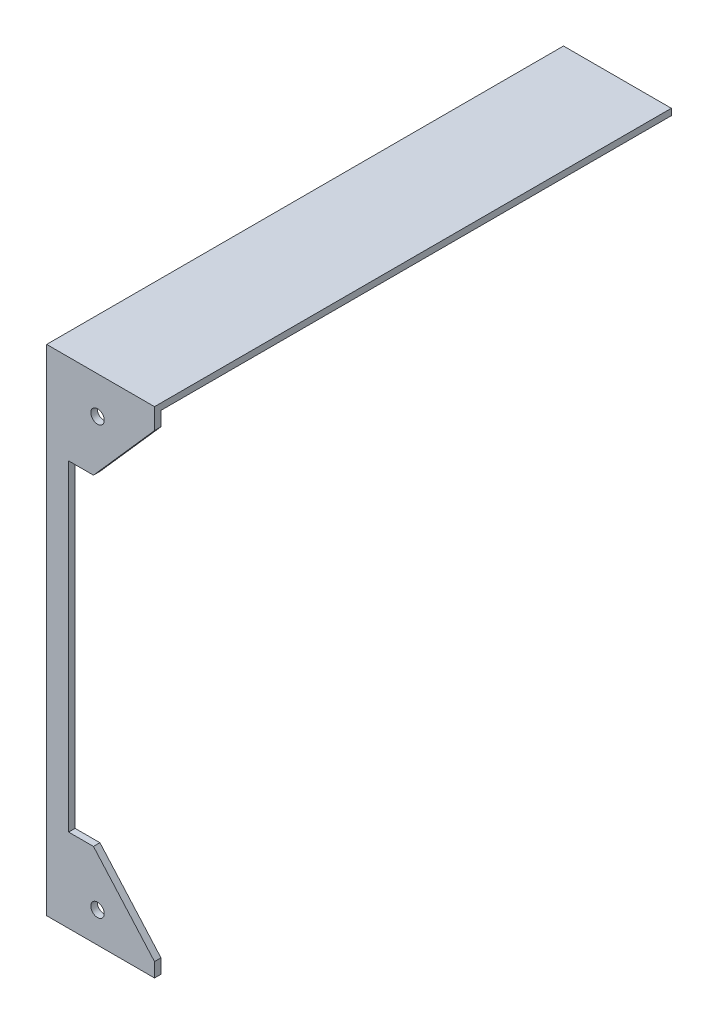
ISO-10303-21;
HEADER;
FILE_DESCRIPTION(('STEP AP214'),'2;1');
FILE_NAME('part.step','',(''),(''),'','','');
FILE_SCHEMA(('AUTOMOTIVE_DESIGN { 1 0 10303 214 1 1 1 1 }'));
ENDSEC;
DATA;
#1=APPLICATION_CONTEXT('core data for automotive mechanical design processes');
#2=APPLICATION_PROTOCOL_DEFINITION('international standard','automotive_design',2000,#1);
#3=PRODUCT_CONTEXT('',#1,'mechanical');
#4=PRODUCT('Part','Part','',(#3));
#5=PRODUCT_RELATED_PRODUCT_CATEGORY('part','',(#4));
#6=PRODUCT_DEFINITION_FORMATION('','',#4);
#7=PRODUCT_DEFINITION_CONTEXT('part definition',#1,'design');
#8=PRODUCT_DEFINITION('design','',#6,#7);
#9=PRODUCT_DEFINITION_SHAPE('','',#8);
#10=(LENGTH_UNIT() NAMED_UNIT(*) SI_UNIT(.MILLI.,.METRE.));
#11=(NAMED_UNIT(*) PLANE_ANGLE_UNIT() SI_UNIT($,.RADIAN.));
#12=(NAMED_UNIT(*) SI_UNIT($,.STERADIAN.) SOLID_ANGLE_UNIT());
#13=UNCERTAINTY_MEASURE_WITH_UNIT(LENGTH_MEASURE(1.E-05),#10,'distance_accuracy_value','');
#14=(GEOMETRIC_REPRESENTATION_CONTEXT(3) GLOBAL_UNCERTAINTY_ASSIGNED_CONTEXT((#13)) GLOBAL_UNIT_ASSIGNED_CONTEXT((#10,
#11,#12)) REPRESENTATION_CONTEXT('',''));
#15=CARTESIAN_POINT('',(0.,0.,0.));
#16=DIRECTION('',(0.,0.,1.));
#17=DIRECTION('',(1.,0.,0.));
#18=AXIS2_PLACEMENT_3D('',#15,#16,#17);
#19=CARTESIAN_POINT('',(0.,0.,1.5875));
#20=DIRECTION('',(0.,0.,-1.));
#21=DIRECTION('',(-1.,0.,0.));
#22=AXIS2_PLACEMENT_3D('',#19,#20,#21);
#23=PLANE('',#22);
#24=DIRECTION('',(0.,-1.,0.));
#25=VECTOR('',#24,1.);
#26=CARTESIAN_POINT('',(-250.,0.,1.5875));
#27=LINE('',#26,#25);
#28=CARTESIAN_POINT('',(-250.,121.5875,1.5875));
#29=VERTEX_POINT('',#28);
#30=CARTESIAN_POINT('',(-250.,0.,1.5875));
#31=VERTEX_POINT('',#30);
#32=EDGE_CURVE('E169',#29,#31,#27,.T.);
#33=ORIENTED_EDGE('',*,*,#32,.T.);
#34=DIRECTION('',(1.,0.,0.));
#35=VECTOR('',#34,1.);
#36=CARTESIAN_POINT('',(-223.5,0.,1.5875));
#37=LINE('',#36,#35);
#38=CARTESIAN_POINT('',(-223.5,0.,1.5875));
#39=VERTEX_POINT('',#38);
#40=EDGE_CURVE('E103',#31,#39,#37,.T.);
#41=ORIENTED_EDGE('',*,*,#40,.T.);
#42=DIRECTION('',(0.,1.,0.));
#43=VECTOR('',#42,1.);
#44=CARTESIAN_POINT('',(-223.5,3.5,1.5875));
#45=LINE('',#44,#43);
#46=CARTESIAN_POINT('',(-223.5,3.5,1.5875));
#47=VERTEX_POINT('',#46);
#48=EDGE_CURVE('E184',#39,#47,#45,.T.);
#49=ORIENTED_EDGE('',*,*,#48,.T.);
#50=DIRECTION('',(-0.661621637086846,0.749837855365093,0.));
#51=VECTOR('',#50,1.);
#52=CARTESIAN_POINT('',(-223.5,3.5,1.5875));
#53=LINE('',#52,#51);
#54=CARTESIAN_POINT('',(-238.5,20.5,1.5875));
#55=VERTEX_POINT('',#54);
#56=EDGE_CURVE('E197',#47,#55,#53,.T.);
#57=ORIENTED_EDGE('',*,*,#56,.T.);
#58=DIRECTION('',(-1.,0.,0.));
#59=VECTOR('',#58,1.);
#60=CARTESIAN_POINT('',(-238.5,20.5,1.5875));
#61=LINE('',#60,#59);
#62=CARTESIAN_POINT('',(-244.6,20.5,1.5875));
#63=VERTEX_POINT('',#62);
#64=EDGE_CURVE('E126',#55,#63,#61,.T.);
#65=ORIENTED_EDGE('',*,*,#64,.T.);
#66=DIRECTION('',(0.,1.,0.));
#67=VECTOR('',#66,1.);
#68=CARTESIAN_POINT('',(-244.6,20.5,1.5875));
#69=LINE('',#68,#67);
#70=CARTESIAN_POINT('',(-244.6,99.5,1.5875));
#71=VERTEX_POINT('',#70);
#72=EDGE_CURVE('E119',#63,#71,#69,.T.);
#73=ORIENTED_EDGE('',*,*,#72,.T.);
#74=DIRECTION('',(1.,0.,0.));
#75=VECTOR('',#74,1.);
#76=CARTESIAN_POINT('',(-244.6,99.5,1.5875));
#77=LINE('',#76,#75);
#78=CARTESIAN_POINT('',(-238.5,99.5,1.5875));
#79=VERTEX_POINT('',#78);
#80=EDGE_CURVE('E123',#71,#79,#77,.T.);
#81=ORIENTED_EDGE('',*,*,#80,.T.);
#82=DIRECTION('',(0.661621637086846,0.749837855365093,0.));
#83=VECTOR('',#82,1.);
#84=CARTESIAN_POINT('',(-238.5,99.5,1.5875));
#85=LINE('',#84,#83);
#86=CARTESIAN_POINT('',(-223.5,116.5,1.5875));
#87=VERTEX_POINT('',#86);
#88=EDGE_CURVE('E56',#79,#87,#85,.T.);
#89=ORIENTED_EDGE('',*,*,#88,.T.);
#90=DIRECTION('',(0.,1.,0.));
#91=VECTOR('',#90,1.);
#92=CARTESIAN_POINT('',(-223.5,116.5,1.5875));
#93=LINE('',#92,#91);
#94=CARTESIAN_POINT('',(-223.5,121.5875,1.5875));
#95=VERTEX_POINT('',#94);
#96=EDGE_CURVE('E143',#87,#95,#93,.T.);
#97=ORIENTED_EDGE('',*,*,#96,.T.);
#98=DIRECTION('',(1.,0.,0.));
#99=VECTOR('',#98,1.);
#100=CARTESIAN_POINT('',(-223.5,121.5875,1.5875));
#101=LINE('',#100,#99);
#102=EDGE_CURVE('E220',#29,#95,#101,.T.);
#103=ORIENTED_EDGE('',*,*,#102,.F.);
#104=EDGE_LOOP('',(#33,#41,#49,#57,#65,#73,#81,#89,#97,#103));
#105=FACE_BOUND('',#104,.T.);
#106=CARTESIAN_POINT('',(-237.5,112.5,1.5875));
#107=DIRECTION('',(0.,0.,1.));
#108=DIRECTION('',(1.,0.,0.));
#109=AXIS2_PLACEMENT_3D('',#106,#107,#108);
#110=CIRCLE('',#109,1.65);
#111=CARTESIAN_POINT('',(-235.85,112.5,1.5875));
#112=VERTEX_POINT('',#111);
#113=EDGE_CURVE('E153',#112,#112,#110,.T.);
#114=ORIENTED_EDGE('',*,*,#113,.F.);
#115=EDGE_LOOP('',(#114));
#116=FACE_BOUND('',#115,.T.);
#117=CARTESIAN_POINT('',(-237.5,7.5,1.5875));
#118=DIRECTION('',(0.,0.,1.));
#119=DIRECTION('',(1.,0.,0.));
#120=AXIS2_PLACEMENT_3D('',#117,#118,#119);
#121=CIRCLE('',#120,1.65);
#122=CARTESIAN_POINT('',(-235.85,7.5,1.5875));
#123=VERTEX_POINT('',#122);
#124=EDGE_CURVE('E206',#123,#123,#121,.T.);
#125=ORIENTED_EDGE('',*,*,#124,.F.);
#126=EDGE_LOOP('',(#125));
#127=FACE_BOUND('',#126,.T.);
#128=ADVANCED_FACE('F39',(#105,#116,#127),#23,.F.);
#129=CARTESIAN_POINT('',(0.,0.,0.));
#130=DIRECTION('',(0.,0.,-1.));
#131=DIRECTION('',(-1.,0.,0.));
#132=AXIS2_PLACEMENT_3D('',#129,#130,#131);
#133=PLANE('',#132);
#134=CARTESIAN_POINT('',(-237.5,112.5,0.));
#135=DIRECTION('',(0.,0.,1.));
#136=DIRECTION('',(1.,0.,0.));
#137=AXIS2_PLACEMENT_3D('',#134,#135,#136);
#138=CIRCLE('',#137,1.65);
#139=CARTESIAN_POINT('',(-235.85,112.5,0.));
#140=VERTEX_POINT('',#139);
#141=EDGE_CURVE('E203',#140,#140,#138,.T.);
#142=ORIENTED_EDGE('',*,*,#141,.T.);
#143=EDGE_LOOP('',(#142));
#144=FACE_BOUND('',#143,.T.);
#145=DIRECTION('',(0.,-1.,0.));
#146=VECTOR('',#145,1.);
#147=CARTESIAN_POINT('',(-250.,0.,0.));
#148=LINE('',#147,#146);
#149=CARTESIAN_POINT('',(-250.,120.,0.));
#150=VERTEX_POINT('',#149);
#151=CARTESIAN_POINT('',(-250.,0.,0.));
#152=VERTEX_POINT('',#151);
#153=EDGE_CURVE('E149',#150,#152,#148,.T.);
#154=ORIENTED_EDGE('',*,*,#153,.F.);
#155=DIRECTION('',(-1.,0.,0.));
#156=VECTOR('',#155,1.);
#157=CARTESIAN_POINT('',(-250.,120.,0.));
#158=LINE('',#157,#156);
#159=CARTESIAN_POINT('',(-223.5,120.,0.));
#160=VERTEX_POINT('',#159);
#161=EDGE_CURVE('E166',#160,#150,#158,.T.);
#162=ORIENTED_EDGE('',*,*,#161,.F.);
#163=DIRECTION('',(0.,1.,0.));
#164=VECTOR('',#163,1.);
#165=CARTESIAN_POINT('',(-223.5,116.5,0.));
#166=LINE('',#165,#164);
#167=CARTESIAN_POINT('',(-223.5,116.5,0.));
#168=VERTEX_POINT('',#167);
#169=EDGE_CURVE('E95',#168,#160,#166,.T.);
#170=ORIENTED_EDGE('',*,*,#169,.F.);
#171=DIRECTION('',(0.661621637086846,0.749837855365093,0.));
#172=VECTOR('',#171,1.);
#173=CARTESIAN_POINT('',(-238.5,99.5,0.));
#174=LINE('',#173,#172);
#175=CARTESIAN_POINT('',(-238.5,99.5,0.));
#176=VERTEX_POINT('',#175);
#177=EDGE_CURVE('E88',#176,#168,#174,.T.);
#178=ORIENTED_EDGE('',*,*,#177,.F.);
#179=DIRECTION('',(1.,0.,0.));
#180=VECTOR('',#179,1.);
#181=CARTESIAN_POINT('',(-244.6,99.5,0.));
#182=LINE('',#181,#180);
#183=CARTESIAN_POINT('',(-244.6,99.5,0.));
#184=VERTEX_POINT('',#183);
#185=EDGE_CURVE('E162',#184,#176,#182,.T.);
#186=ORIENTED_EDGE('',*,*,#185,.F.);
#187=DIRECTION('',(0.,1.,0.));
#188=VECTOR('',#187,1.);
#189=CARTESIAN_POINT('',(-244.6,20.5,0.));
#190=LINE('',#189,#188);
#191=CARTESIAN_POINT('',(-244.6,20.5,0.));
#192=VERTEX_POINT('',#191);
#193=EDGE_CURVE('E135',#192,#184,#190,.T.);
#194=ORIENTED_EDGE('',*,*,#193,.F.);
#195=DIRECTION('',(-1.,0.,0.));
#196=VECTOR('',#195,1.);
#197=CARTESIAN_POINT('',(-238.5,20.5,0.));
#198=LINE('',#197,#196);
#199=CARTESIAN_POINT('',(-238.5,20.5,0.));
#200=VERTEX_POINT('',#199);
#201=EDGE_CURVE('E159',#200,#192,#198,.T.);
#202=ORIENTED_EDGE('',*,*,#201,.F.);
#203=DIRECTION('',(-0.661621637086846,0.749837855365093,0.));
#204=VECTOR('',#203,1.);
#205=CARTESIAN_POINT('',(-223.5,3.5,0.));
#206=LINE('',#205,#204);
#207=CARTESIAN_POINT('',(-223.5,3.5,0.));
#208=VERTEX_POINT('',#207);
#209=EDGE_CURVE('E157',#208,#200,#206,.T.);
#210=ORIENTED_EDGE('',*,*,#209,.F.);
#211=DIRECTION('',(0.,1.,0.));
#212=VECTOR('',#211,1.);
#213=CARTESIAN_POINT('',(-223.5,3.5,0.));
#214=LINE('',#213,#212);
#215=CARTESIAN_POINT('',(-223.5,0.,0.));
#216=VERTEX_POINT('',#215);
#217=EDGE_CURVE('E155',#216,#208,#214,.T.);
#218=ORIENTED_EDGE('',*,*,#217,.F.);
#219=DIRECTION('',(1.,0.,0.));
#220=VECTOR('',#219,1.);
#221=CARTESIAN_POINT('',(-223.5,0.,0.));
#222=LINE('',#221,#220);
#223=EDGE_CURVE('E152',#152,#216,#222,.T.);
#224=ORIENTED_EDGE('',*,*,#223,.F.);
#225=EDGE_LOOP('',(#154,#162,#170,#178,#186,#194,#202,#210,#218,#224));
#226=FACE_BOUND('',#225,.T.);
#227=CARTESIAN_POINT('',(-237.5,7.5,0.));
#228=DIRECTION('',(0.,0.,1.));
#229=DIRECTION('',(1.,0.,0.));
#230=AXIS2_PLACEMENT_3D('',#227,#228,#229);
#231=CIRCLE('',#230,1.65);
#232=CARTESIAN_POINT('',(-235.85,7.5,0.));
#233=VERTEX_POINT('',#232);
#234=EDGE_CURVE('E209',#233,#233,#231,.T.);
#235=ORIENTED_EDGE('',*,*,#234,.T.);
#236=EDGE_LOOP('',(#235));
#237=FACE_BOUND('',#236,.T.);
#238=ADVANCED_FACE('F188',(#144,#226,#237),#133,.T.);
#239=CARTESIAN_POINT('',(-250.,0.,1.5875));
#240=DIRECTION('',(1.,0.,0.));
#241=DIRECTION('',(0.,0.,-1.));
#242=AXIS2_PLACEMENT_3D('',#239,#240,#241);
#243=PLANE('',#242);
#244=ORIENTED_EDGE('',*,*,#153,.T.);
#245=DIRECTION('',(0.,0.,-1.));
#246=VECTOR('',#245,1.);
#247=CARTESIAN_POINT('',(-250.,0.,1.5875));
#248=LINE('',#247,#246);
#249=EDGE_CURVE('E11',#31,#152,#248,.T.);
#250=ORIENTED_EDGE('',*,*,#249,.F.);
#251=ORIENTED_EDGE('',*,*,#32,.F.);
#252=DIRECTION('',(0.,0.,1.));
#253=VECTOR('',#252,1.);
#254=CARTESIAN_POINT('',(-250.,121.5875,1.5875));
#255=LINE('',#254,#253);
#256=CARTESIAN_POINT('',(-250.,121.5875,-125.4125));
#257=VERTEX_POINT('',#256);
#258=EDGE_CURVE('E232',#257,#29,#255,.T.);
#259=ORIENTED_EDGE('',*,*,#258,.F.);
#260=DIRECTION('',(0.,-1.,0.));
#261=VECTOR('',#260,1.);
#262=CARTESIAN_POINT('',(-250.,121.5875,-125.4125));
#263=LINE('',#262,#261);
#264=CARTESIAN_POINT('',(-250.,120.,-125.4125));
#265=VERTEX_POINT('',#264);
#266=EDGE_CURVE('E217',#257,#265,#263,.T.);
#267=ORIENTED_EDGE('',*,*,#266,.T.);
#268=DIRECTION('',(0.,0.,1.));
#269=VECTOR('',#268,1.);
#270=CARTESIAN_POINT('',(-250.,120.,1.5875));
#271=LINE('',#270,#269);
#272=EDGE_CURVE('E221',#265,#150,#271,.T.);
#273=ORIENTED_EDGE('',*,*,#272,.T.);
#274=EDGE_LOOP('',(#244,#250,#251,#259,#267,#273));
#275=FACE_BOUND('',#274,.T.);
#276=ADVANCED_FACE('F41',(#275),#243,.F.);
#277=CARTESIAN_POINT('',(-223.5,0.,1.5875));
#278=DIRECTION('',(0.,1.,0.));
#279=DIRECTION('',(0.,0.,1.));
#280=AXIS2_PLACEMENT_3D('',#277,#278,#279);
#281=PLANE('',#280);
#282=ORIENTED_EDGE('',*,*,#223,.T.);
#283=DIRECTION('',(0.,0.,-1.));
#284=VECTOR('',#283,1.);
#285=CARTESIAN_POINT('',(-223.5,0.,1.5875));
#286=LINE('',#285,#284);
#287=EDGE_CURVE('E48',#39,#216,#286,.T.);
#288=ORIENTED_EDGE('',*,*,#287,.F.);
#289=ORIENTED_EDGE('',*,*,#40,.F.);
#290=ORIENTED_EDGE('',*,*,#249,.T.);
#291=EDGE_LOOP('',(#282,#288,#289,#290));
#292=FACE_BOUND('',#291,.T.);
#293=ADVANCED_FACE('F303',(#292),#281,.F.);
#294=CARTESIAN_POINT('',(-223.5,3.5,1.5875));
#295=DIRECTION('',(-1.,0.,0.));
#296=DIRECTION('',(0.,0.,1.));
#297=AXIS2_PLACEMENT_3D('',#294,#295,#296);
#298=PLANE('',#297);
#299=ORIENTED_EDGE('',*,*,#217,.T.);
#300=DIRECTION('',(0.,0.,-1.));
#301=VECTOR('',#300,1.);
#302=CARTESIAN_POINT('',(-223.5,3.5,1.5875));
#303=LINE('',#302,#301);
#304=EDGE_CURVE('E176',#47,#208,#303,.T.);
#305=ORIENTED_EDGE('',*,*,#304,.F.);
#306=ORIENTED_EDGE('',*,*,#48,.F.);
#307=ORIENTED_EDGE('',*,*,#287,.T.);
#308=EDGE_LOOP('',(#299,#305,#306,#307));
#309=FACE_BOUND('',#308,.T.);
#310=ADVANCED_FACE('F182',(#309),#298,.F.);
#311=CARTESIAN_POINT('',(-223.5,3.5,1.5875));
#312=DIRECTION('',(-0.749837855365093,-0.661621637086846,0.));
#313=DIRECTION('',(0.661621637086846,-0.749837855365093,0.));
#314=AXIS2_PLACEMENT_3D('',#311,#312,#313);
#315=PLANE('',#314);
#316=ORIENTED_EDGE('',*,*,#209,.T.);
#317=DIRECTION('',(0.,0.,-1.));
#318=VECTOR('',#317,1.);
#319=CARTESIAN_POINT('',(-238.5,20.5,1.5875));
#320=LINE('',#319,#318);
#321=EDGE_CURVE('E173',#55,#200,#320,.T.);
#322=ORIENTED_EDGE('',*,*,#321,.F.);
#323=ORIENTED_EDGE('',*,*,#56,.F.);
#324=ORIENTED_EDGE('',*,*,#304,.T.);
#325=EDGE_LOOP('',(#316,#322,#323,#324));
#326=FACE_BOUND('',#325,.T.);
#327=ADVANCED_FACE('F193',(#326),#315,.F.);
#328=CARTESIAN_POINT('',(-238.5,20.5,1.5875));
#329=DIRECTION('',(0.,-1.,0.));
#330=DIRECTION('',(0.,0.,-1.));
#331=AXIS2_PLACEMENT_3D('',#328,#329,#330);
#332=PLANE('',#331);
#333=ORIENTED_EDGE('',*,*,#201,.T.);
#334=DIRECTION('',(0.,0.,-1.));
#335=VECTOR('',#334,1.);
#336=CARTESIAN_POINT('',(-244.6,20.5,1.5875));
#337=LINE('',#336,#335);
#338=EDGE_CURVE('E138',#63,#192,#337,.T.);
#339=ORIENTED_EDGE('',*,*,#338,.F.);
#340=ORIENTED_EDGE('',*,*,#64,.F.);
#341=ORIENTED_EDGE('',*,*,#321,.T.);
#342=EDGE_LOOP('',(#333,#339,#340,#341));
#343=FACE_BOUND('',#342,.T.);
#344=ADVANCED_FACE('F196',(#343),#332,.F.);
#345=CARTESIAN_POINT('',(-244.6,20.5,1.5875));
#346=DIRECTION('',(-1.,0.,0.));
#347=DIRECTION('',(0.,0.,1.));
#348=AXIS2_PLACEMENT_3D('',#345,#346,#347);
#349=PLANE('',#348);
#350=ORIENTED_EDGE('',*,*,#193,.T.);
#351=DIRECTION('',(0.,0.,-1.));
#352=VECTOR('',#351,1.);
#353=CARTESIAN_POINT('',(-244.6,99.5,1.5875));
#354=LINE('',#353,#352);
#355=EDGE_CURVE('E132',#71,#184,#354,.T.);
#356=ORIENTED_EDGE('',*,*,#355,.F.);
#357=ORIENTED_EDGE('',*,*,#72,.F.);
#358=ORIENTED_EDGE('',*,*,#338,.T.);
#359=EDGE_LOOP('',(#350,#356,#357,#358));
#360=FACE_BOUND('',#359,.T.);
#361=ADVANCED_FACE('F133',(#360),#349,.F.);
#362=CARTESIAN_POINT('',(-244.6,99.5,1.5875));
#363=DIRECTION('',(0.,1.,0.));
#364=DIRECTION('',(0.,0.,1.));
#365=AXIS2_PLACEMENT_3D('',#362,#363,#364);
#366=PLANE('',#365);
#367=ORIENTED_EDGE('',*,*,#185,.T.);
#368=DIRECTION('',(0.,0.,-1.));
#369=VECTOR('',#368,1.);
#370=CARTESIAN_POINT('',(-238.5,99.5,1.5875));
#371=LINE('',#370,#369);
#372=EDGE_CURVE('E139',#79,#176,#371,.T.);
#373=ORIENTED_EDGE('',*,*,#372,.F.);
#374=ORIENTED_EDGE('',*,*,#80,.F.);
#375=ORIENTED_EDGE('',*,*,#355,.T.);
#376=EDGE_LOOP('',(#367,#373,#374,#375));
#377=FACE_BOUND('',#376,.T.);
#378=ADVANCED_FACE('F141',(#377),#366,.F.);
#379=CARTESIAN_POINT('',(-238.5,99.5,1.5875));
#380=DIRECTION('',(-0.749837855365093,0.661621637086846,0.));
#381=DIRECTION('',(-0.661621637086846,-0.749837855365093,0.));
#382=AXIS2_PLACEMENT_3D('',#379,#380,#381);
#383=PLANE('',#382);
#384=ORIENTED_EDGE('',*,*,#177,.T.);
#385=DIRECTION('',(0.,0.,-1.));
#386=VECTOR('',#385,1.);
#387=CARTESIAN_POINT('',(-223.5,116.5,1.5875));
#388=LINE('',#387,#386);
#389=EDGE_CURVE('E148',#87,#168,#388,.T.);
#390=ORIENTED_EDGE('',*,*,#389,.F.);
#391=ORIENTED_EDGE('',*,*,#88,.F.);
#392=ORIENTED_EDGE('',*,*,#372,.T.);
#393=EDGE_LOOP('',(#384,#390,#391,#392));
#394=FACE_BOUND('',#393,.T.);
#395=ADVANCED_FACE('F291',(#394),#383,.F.);
#396=CARTESIAN_POINT('',(-223.5,116.5,1.5875));
#397=DIRECTION('',(-1.,0.,0.));
#398=DIRECTION('',(0.,0.,1.));
#399=AXIS2_PLACEMENT_3D('',#396,#397,#398);
#400=PLANE('',#399);
#401=ORIENTED_EDGE('',*,*,#169,.T.);
#402=DIRECTION('',(0.,0.,-1.));
#403=VECTOR('',#402,1.);
#404=CARTESIAN_POINT('',(-223.5,120.,-125.4125));
#405=LINE('',#404,#403);
#406=CARTESIAN_POINT('',(-223.5,120.,-125.4125));
#407=VERTEX_POINT('',#406);
#408=EDGE_CURVE('E228',#160,#407,#405,.T.);
#409=ORIENTED_EDGE('',*,*,#408,.T.);
#410=DIRECTION('',(0.,-1.,0.));
#411=VECTOR('',#410,1.);
#412=CARTESIAN_POINT('',(-223.5,121.5875,-125.4125));
#413=LINE('',#412,#411);
#414=CARTESIAN_POINT('',(-223.5,121.5875,-125.4125));
#415=VERTEX_POINT('',#414);
#416=EDGE_CURVE('E212',#415,#407,#413,.T.);
#417=ORIENTED_EDGE('',*,*,#416,.F.);
#418=DIRECTION('',(0.,0.,-1.));
#419=VECTOR('',#418,1.);
#420=CARTESIAN_POINT('',(-223.5,121.5875,-125.4125));
#421=LINE('',#420,#419);
#422=EDGE_CURVE('E224',#95,#415,#421,.T.);
#423=ORIENTED_EDGE('',*,*,#422,.F.);
#424=ORIENTED_EDGE('',*,*,#96,.F.);
#425=ORIENTED_EDGE('',*,*,#389,.T.);
#426=EDGE_LOOP('',(#401,#409,#417,#423,#424,#425));
#427=FACE_BOUND('',#426,.T.);
#428=ADVANCED_FACE('F252',(#427),#400,.F.);
#429=CARTESIAN_POINT('',(-237.5,112.5,1.5875));
#430=DIRECTION('',(0.,0.,-1.));
#431=DIRECTION('',(-1.,0.,0.));
#432=AXIS2_PLACEMENT_3D('',#429,#430,#431);
#433=CYLINDRICAL_SURFACE('',#432,1.65);
#434=ORIENTED_EDGE('',*,*,#141,.F.);
#435=EDGE_LOOP('',(#434));
#436=FACE_BOUND('',#435,.T.);
#437=ORIENTED_EDGE('',*,*,#113,.T.);
#438=EDGE_LOOP('',(#437));
#439=FACE_BOUND('',#438,.T.);
#440=ADVANCED_FACE('F286',(#436,#439),#433,.F.);
#441=CARTESIAN_POINT('',(-237.5,7.5,1.5875));
#442=DIRECTION('',(0.,0.,-1.));
#443=DIRECTION('',(-1.,0.,0.));
#444=AXIS2_PLACEMENT_3D('',#441,#442,#443);
#445=CYLINDRICAL_SURFACE('',#444,1.65);
#446=ORIENTED_EDGE('',*,*,#234,.F.);
#447=EDGE_LOOP('',(#446));
#448=FACE_BOUND('',#447,.T.);
#449=ORIENTED_EDGE('',*,*,#124,.T.);
#450=EDGE_LOOP('',(#449));
#451=FACE_BOUND('',#450,.T.);
#452=ADVANCED_FACE('F323',(#448,#451),#445,.F.);
#453=CARTESIAN_POINT('',(-250.,121.5875,-125.4125));
#454=DIRECTION('',(0.,0.,1.));
#455=DIRECTION('',(1.,0.,0.));
#456=AXIS2_PLACEMENT_3D('',#453,#454,#455);
#457=PLANE('',#456);
#458=DIRECTION('',(-1.,0.,0.));
#459=VECTOR('',#458,1.);
#460=CARTESIAN_POINT('',(-250.,120.,-125.4125));
#461=LINE('',#460,#459);
#462=EDGE_CURVE('E225',#407,#265,#461,.T.);
#463=ORIENTED_EDGE('',*,*,#462,.T.);
#464=ORIENTED_EDGE('',*,*,#266,.F.);
#465=DIRECTION('',(-1.,0.,0.));
#466=VECTOR('',#465,1.);
#467=CARTESIAN_POINT('',(-250.,121.5875,-125.4125));
#468=LINE('',#467,#466);
#469=EDGE_CURVE('E235',#415,#257,#468,.T.);
#470=ORIENTED_EDGE('',*,*,#469,.F.);
#471=ORIENTED_EDGE('',*,*,#416,.T.);
#472=EDGE_LOOP('',(#463,#464,#470,#471));
#473=FACE_BOUND('',#472,.T.);
#474=ADVANCED_FACE('F257',(#473),#457,.F.);
#475=CARTESIAN_POINT('',(0.,121.5875,0.));
#476=DIRECTION('',(0.,-1.,0.));
#477=DIRECTION('',(0.,0.,-1.));
#478=AXIS2_PLACEMENT_3D('',#475,#476,#477);
#479=PLANE('',#478);
#480=ORIENTED_EDGE('',*,*,#422,.T.);
#481=ORIENTED_EDGE('',*,*,#469,.T.);
#482=ORIENTED_EDGE('',*,*,#258,.T.);
#483=ORIENTED_EDGE('',*,*,#102,.T.);
#484=EDGE_LOOP('',(#480,#481,#482,#483));
#485=FACE_BOUND('',#484,.T.);
#486=ADVANCED_FACE('F243',(#485),#479,.F.);
#487=CARTESIAN_POINT('',(0.,120.,0.));
#488=DIRECTION('',(0.,-1.,0.));
#489=DIRECTION('',(0.,0.,-1.));
#490=AXIS2_PLACEMENT_3D('',#487,#488,#489);
#491=PLANE('',#490);
#492=ORIENTED_EDGE('',*,*,#408,.F.);
#493=ORIENTED_EDGE('',*,*,#161,.T.);
#494=ORIENTED_EDGE('',*,*,#272,.F.);
#495=ORIENTED_EDGE('',*,*,#462,.F.);
#496=EDGE_LOOP('',(#492,#493,#494,#495));
#497=FACE_BOUND('',#496,.T.);
#498=ADVANCED_FACE('F269',(#497),#491,.T.);
#499=CLOSED_SHELL('',(#128,#238,#276,#293,#310,#327,#344,#361,#378,#395,#428,#440,#452,#474,
#486,#498));
#500=MANIFOLD_SOLID_BREP('B2',#499);
#501=ADVANCED_BREP_SHAPE_REPRESENTATION('',(#18,#500),#14);
#502=SHAPE_DEFINITION_REPRESENTATION(#9,#501);
ENDSEC;
END-ISO-10303-21;
